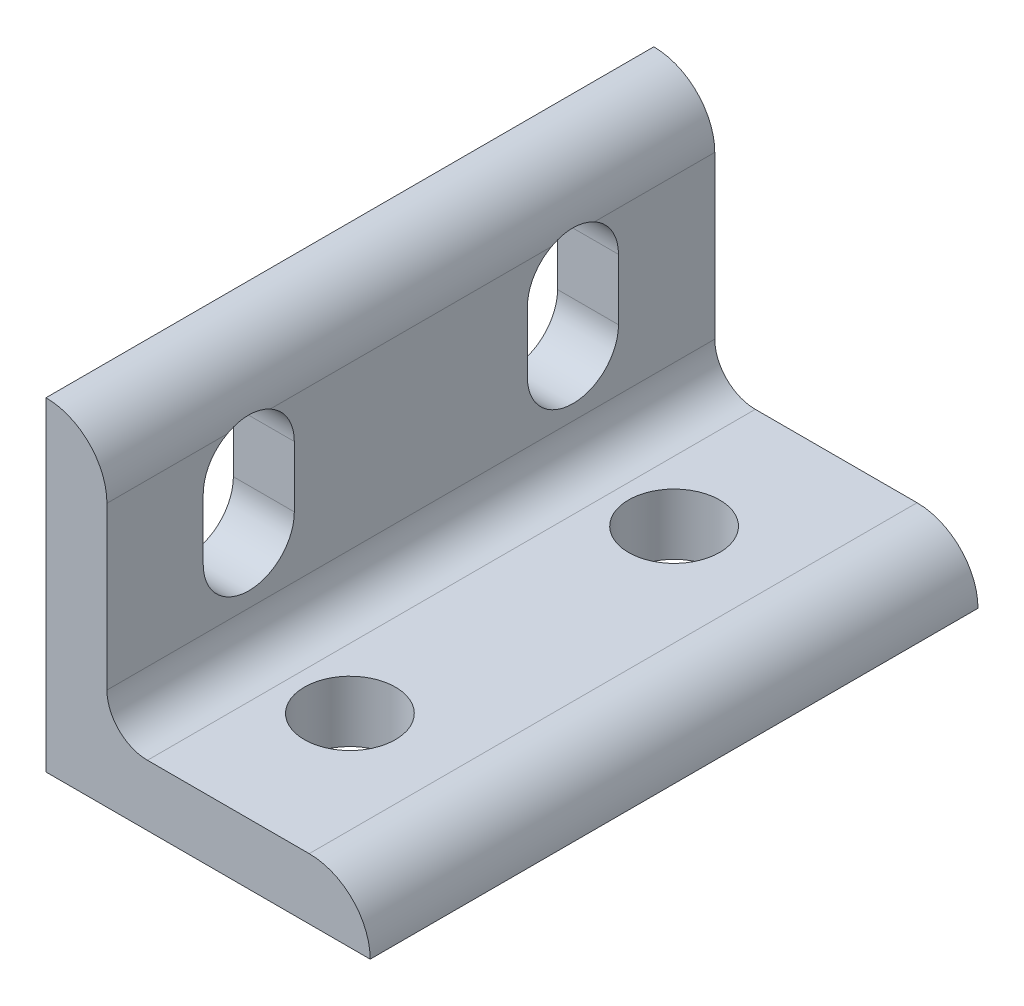
ISO-10303-21;
HEADER;
FILE_DESCRIPTION(('STEP AP214'),'2;1');
FILE_NAME('part.step','',(''),(''),'','','');
FILE_SCHEMA(('AUTOMOTIVE_DESIGN { 1 0 10303 214 1 1 1 1 }'));
ENDSEC;
DATA;
#1=APPLICATION_CONTEXT('core data for automotive mechanical design processes');
#2=APPLICATION_PROTOCOL_DEFINITION('international standard','automotive_design',2000,#1);
#3=PRODUCT_CONTEXT('',#1,'mechanical');
#4=PRODUCT('Part','Part','',(#3));
#5=PRODUCT_RELATED_PRODUCT_CATEGORY('part','',(#4));
#6=PRODUCT_DEFINITION_FORMATION('','',#4);
#7=PRODUCT_DEFINITION_CONTEXT('part definition',#1,'design');
#8=PRODUCT_DEFINITION('design','',#6,#7);
#9=PRODUCT_DEFINITION_SHAPE('','',#8);
#10=(LENGTH_UNIT() NAMED_UNIT(*) SI_UNIT(.MILLI.,.METRE.));
#11=(NAMED_UNIT(*) PLANE_ANGLE_UNIT() SI_UNIT($,.RADIAN.));
#12=(NAMED_UNIT(*) SI_UNIT($,.STERADIAN.) SOLID_ANGLE_UNIT());
#13=UNCERTAINTY_MEASURE_WITH_UNIT(LENGTH_MEASURE(1.E-05),#10,'distance_accuracy_value','');
#14=(GEOMETRIC_REPRESENTATION_CONTEXT(3) GLOBAL_UNCERTAINTY_ASSIGNED_CONTEXT((#13)) GLOBAL_UNIT_ASSIGNED_CONTEXT((#10,
#11,#12)) REPRESENTATION_CONTEXT('',''));
#15=CARTESIAN_POINT('',(0.,0.,0.));
#16=DIRECTION('',(0.,0.,1.));
#17=DIRECTION('',(1.,0.,0.));
#18=AXIS2_PLACEMENT_3D('',#15,#16,#17);
#19=CARTESIAN_POINT('',(-12.7,7.9248,-23.8125));
#20=DIRECTION('',(0.,0.,1.));
#21=DIRECTION('',(1.,0.,0.));
#22=AXIS2_PLACEMENT_3D('',#19,#20,#21);
#23=CYLINDRICAL_SURFACE('',#22,4.7752);
#24=CARTESIAN_POINT('',(-7.9248,7.9248,11.0220132509462));
#25=CARTESIAN_POINT('',(-7.92481560049591,7.97198264026627,11.1105530499581));
#26=CARTESIAN_POINT('',(-7.92550012205361,8.01540977478819,11.2010856695941));
#27=CARTESIAN_POINT('',(-7.92764776843833,8.0944880787926,11.3854704138337));
#28=CARTESIAN_POINT('',(-7.929110840339,8.13013977662214,11.4793223123857));
#29=CARTESIAN_POINT('',(-7.93225439032208,8.19336625267331,11.6695638568773));
#30=CARTESIAN_POINT('',(-7.93393457377952,8.22095181424073,11.7659499252254));
#31=CARTESIAN_POINT('',(-7.93708478391002,8.26791971032118,11.960702632401));
#32=CARTESIAN_POINT('',(-7.93855481380049,8.28730217043143,12.0590692408804));
#33=CARTESIAN_POINT('',(-7.94096961658513,8.31773484760735,12.2571525031942));
#34=CARTESIAN_POINT('',(-7.94191406229188,8.32877987596424,12.3568699584881));
#35=CARTESIAN_POINT('',(-7.94309359017063,8.3424409536407,12.5569310344266));
#36=CARTESIAN_POINT('',(-7.94332834804511,8.34505314954707,12.6572749203435));
#37=CARTESIAN_POINT('',(-7.94304377497829,8.341819075309,12.8578030712449));
#38=CARTESIAN_POINT('',(-7.94252460460012,8.33597460617069,12.9579873656688));
#39=CARTESIAN_POINT('',(-7.94083039182643,8.31587724756712,13.1574567845667));
#40=CARTESIAN_POINT('',(-7.93965566575332,8.30162841323472,13.2567423192529));
#41=CARTESIAN_POINT('',(-7.93701861799582,8.26658902460884,13.4443374260927));
#42=CARTESIAN_POINT('',(-7.93559448865452,8.24655339572945,13.5327894882935));
#43=CARTESIAN_POINT('',(-7.93266836545639,8.19981049650334,13.707906238063));
#44=CARTESIAN_POINT('',(-7.93116637764445,8.17310374348454,13.7945710636631));
#45=CARTESIAN_POINT('',(-7.92842086118506,8.11314773705982,13.9656796838601));
#46=CARTESIAN_POINT('',(-7.92717751363214,8.07989393104252,14.0501218863291));
#47=CARTESIAN_POINT('',(-7.9253721376969,8.00704969992215,14.2162479649546));
#48=CARTESIAN_POINT('',(-7.92481020248326,7.96745840914012,14.2979314624328));
#49=CARTESIAN_POINT('',(-7.9248,7.9248,14.3779867490538));
#50=B_SPLINE_CURVE_WITH_KNOTS('',3,(#24,#25,#26,#27,#28,#29,#30,#31,#32,#33,#34,#35,#36,#37,#38,
#39,#40,#41,#42,#43,#44,#45,#46,#47,#48,#49),.UNSPECIFIED.,.F.,.F.,(4,2,2,2,2,2,2,2,2,2,2,2,4),
(0.,0.300879588223929,0.601738725068878,0.902193795053611,1.20264426462114,1.5032815624204,
1.80405621808537,2.1047668275479,2.40533246174311,2.67718634841712,2.94901916008736,
3.22104166750748,3.49310136403919),.UNSPECIFIED.);
#51=CARTESIAN_POINT('',(-7.9248,7.9248,11.0220132509462));
#52=VERTEX_POINT('',#51);
#53=CARTESIAN_POINT('',(-7.9248,7.9248,14.3779867490538));
#54=VERTEX_POINT('',#53);
#55=EDGE_CURVE('E264',#52,#54,#50,.T.);
#56=ORIENTED_EDGE('',*,*,#55,.F.);
#57=DIRECTION('',(0.,0.,1.));
#58=VECTOR('',#57,1.);
#59=CARTESIAN_POINT('',(-7.9248,7.9248,-23.8125));
#60=LINE('',#59,#58);
#61=CARTESIAN_POINT('',(-7.9248,7.9248,-11.0220132509462));
#62=VERTEX_POINT('',#61);
#63=EDGE_CURVE('E26',#62,#52,#60,.T.);
#64=ORIENTED_EDGE('',*,*,#63,.F.);
#65=CARTESIAN_POINT('',(-7.9248,7.9248,-14.3779867490538));
#66=CARTESIAN_POINT('',(-7.92481560049591,7.97198264026627,-14.2894469500419));
#67=CARTESIAN_POINT('',(-7.92550012205361,8.01540977478819,-14.1989143304059));
#68=CARTESIAN_POINT('',(-7.92764776843833,8.0944880787926,-14.0145295861663));
#69=CARTESIAN_POINT('',(-7.929110840339,8.13013977662214,-13.9206776876143));
#70=CARTESIAN_POINT('',(-7.93225439032208,8.19336625267331,-13.7304361431227));
#71=CARTESIAN_POINT('',(-7.93393457377952,8.22095181424073,-13.6340500747746));
#72=CARTESIAN_POINT('',(-7.93708478391002,8.26791971032118,-13.439297367599));
#73=CARTESIAN_POINT('',(-7.93855481380049,8.28730217043143,-13.3409307591196));
#74=CARTESIAN_POINT('',(-7.94096961658513,8.31773484760735,-13.1428474968058));
#75=CARTESIAN_POINT('',(-7.94191406229188,8.32877987596424,-13.0431300415119));
#76=CARTESIAN_POINT('',(-7.94309359017063,8.3424409536407,-12.8430689655734));
#77=CARTESIAN_POINT('',(-7.94332834804511,8.34505314954707,-12.7427250796565));
#78=CARTESIAN_POINT('',(-7.94304377497829,8.341819075309,-12.5421969287551));
#79=CARTESIAN_POINT('',(-7.94252460460012,8.33597460617069,-12.4420126343312));
#80=CARTESIAN_POINT('',(-7.94083039182643,8.31587724756712,-12.2425432154333));
#81=CARTESIAN_POINT('',(-7.93965566575332,8.30162841323472,-12.1432576807471));
#82=CARTESIAN_POINT('',(-7.93701861799582,8.26658902460884,-11.9556625739073));
#83=CARTESIAN_POINT('',(-7.93559448865452,8.24655339572945,-11.8672105117065));
#84=CARTESIAN_POINT('',(-7.93266836545639,8.19981049650334,-11.692093761937));
#85=CARTESIAN_POINT('',(-7.93116637764445,8.17310374348454,-11.6054289363369));
#86=CARTESIAN_POINT('',(-7.92842086118506,8.11314773705982,-11.4343203161399));
#87=CARTESIAN_POINT('',(-7.92717751363214,8.07989393104252,-11.3498781136709));
#88=CARTESIAN_POINT('',(-7.9253721376969,8.00704969992215,-11.1837520350454));
#89=CARTESIAN_POINT('',(-7.92481020248326,7.96745840914012,-11.1020685375672));
#90=CARTESIAN_POINT('',(-7.9248,7.9248,-11.0220132509462));
#91=B_SPLINE_CURVE_WITH_KNOTS('',3,(#65,#66,#67,#68,#69,#70,#71,#72,#73,#74,#75,#76,#77,#78,#79,
#80,#81,#82,#83,#84,#85,#86,#87,#88,#89,#90),.UNSPECIFIED.,.F.,.F.,(4,2,2,2,2,2,2,2,2,2,2,2,4),
(0.,0.300879588223929,0.601738725068878,0.902193795053611,1.20264426462114,1.50328156242039,
1.80405621808537,2.1047668275479,2.40533246174311,2.67718634841712,2.94901916008735,
3.22104166750748,3.49310136403919),.UNSPECIFIED.);
#92=CARTESIAN_POINT('',(-7.9248,7.9248,-14.3779867490538));
#93=VERTEX_POINT('',#92);
#94=EDGE_CURVE('E205',#93,#62,#91,.T.);
#95=ORIENTED_EDGE('',*,*,#94,.F.);
#96=CARTESIAN_POINT('',(-7.9248,7.9248,-23.8125));
#97=VERTEX_POINT('',#96);
#98=EDGE_CURVE('E11',#97,#93,#60,.T.);
#99=ORIENTED_EDGE('',*,*,#98,.F.);
#100=CARTESIAN_POINT('',(-12.7,7.9248,-23.8125));
#101=DIRECTION('',(0.,0.,1.));
#102=DIRECTION('',(1.,0.,0.));
#103=AXIS2_PLACEMENT_3D('',#100,#101,#102);
#104=CIRCLE('',#103,4.7752);
#105=CARTESIAN_POINT('',(-12.7,12.7,-23.8125));
#106=VERTEX_POINT('',#105);
#107=EDGE_CURVE('E308',#97,#106,#104,.T.);
#108=ORIENTED_EDGE('',*,*,#107,.T.);
#109=DIRECTION('',(0.,0.,1.));
#110=VECTOR('',#109,1.);
#111=CARTESIAN_POINT('',(-12.7,12.7,-23.8125));
#112=LINE('',#111,#110);
#113=CARTESIAN_POINT('',(-12.7,12.7,23.8125));
#114=VERTEX_POINT('',#113);
#115=EDGE_CURVE('E21',#106,#114,#112,.T.);
#116=ORIENTED_EDGE('',*,*,#115,.T.);
#117=CARTESIAN_POINT('',(-12.7,7.9248,23.8125));
#118=DIRECTION('',(0.,0.,1.));
#119=DIRECTION('',(1.,0.,0.));
#120=AXIS2_PLACEMENT_3D('',#117,#118,#119);
#121=CIRCLE('',#120,4.7752);
#122=CARTESIAN_POINT('',(-7.9248,7.9248,23.8125));
#123=VERTEX_POINT('',#122);
#124=EDGE_CURVE('E327',#123,#114,#121,.T.);
#125=ORIENTED_EDGE('',*,*,#124,.F.);
#126=EDGE_CURVE('E28',#54,#123,#60,.T.);
#127=ORIENTED_EDGE('',*,*,#126,.F.);
#128=EDGE_LOOP('',(#56,#64,#95,#99,#108,#116,#125,#127));
#129=FACE_BOUND('',#128,.T.);
#130=ADVANCED_FACE('F17',(#129),#23,.T.);
#131=CARTESIAN_POINT('',(-7.9248,-4.7498,-23.8125));
#132=DIRECTION('',(1.,0.,0.));
#133=DIRECTION('',(0.,0.,-1.));
#134=AXIS2_PLACEMENT_3D('',#131,#132,#133);
#135=PLANE('',#134);
#136=CARTESIAN_POINT('',(-7.9248,4.7752,12.7));
#137=DIRECTION('',(1.,0.,0.));
#138=DIRECTION('',(0.,0.,-1.));
#139=AXIS2_PLACEMENT_3D('',#136,#137,#138);
#140=CIRCLE('',#139,3.5687);
#141=CARTESIAN_POINT('',(-7.9248,4.7752,9.1313));
#142=VERTEX_POINT('',#141);
#143=EDGE_CURVE('E268',#142,#52,#140,.T.);
#144=ORIENTED_EDGE('',*,*,#143,.F.);
#145=DIRECTION('',(0.,1.,0.));
#146=VECTOR('',#145,1.);
#147=CARTESIAN_POINT('',(-7.9248,-4.7498,9.1313));
#148=LINE('',#147,#146);
#149=CARTESIAN_POINT('',(-7.9248,0.,9.1313));
#150=VERTEX_POINT('',#149);
#151=EDGE_CURVE('E357',#150,#142,#148,.T.);
#152=ORIENTED_EDGE('',*,*,#151,.F.);
#153=CARTESIAN_POINT('',(-7.9248,0.,12.7));
#154=DIRECTION('',(1.,0.,0.));
#155=DIRECTION('',(0.,0.,-1.));
#156=AXIS2_PLACEMENT_3D('',#153,#154,#155);
#157=CIRCLE('',#156,3.5687);
#158=CARTESIAN_POINT('',(-7.9248,0.,16.2687));
#159=VERTEX_POINT('',#158);
#160=EDGE_CURVE('E356',#159,#150,#157,.T.);
#161=ORIENTED_EDGE('',*,*,#160,.F.);
#162=DIRECTION('',(0.,-1.,0.));
#163=VECTOR('',#162,1.);
#164=CARTESIAN_POINT('',(-7.9248,-4.7498,16.2687));
#165=LINE('',#164,#163);
#166=CARTESIAN_POINT('',(-7.9248,4.7752,16.2687));
#167=VERTEX_POINT('',#166);
#168=EDGE_CURVE('E213',#167,#159,#165,.T.);
#169=ORIENTED_EDGE('',*,*,#168,.F.);
#170=EDGE_CURVE('E144',#54,#167,#140,.T.);
#171=ORIENTED_EDGE('',*,*,#170,.F.);
#172=ORIENTED_EDGE('',*,*,#126,.T.);
#173=DIRECTION('',(0.,1.,0.));
#174=VECTOR('',#173,1.);
#175=CARTESIAN_POINT('',(-7.9248,-4.7498,23.8125));
#176=LINE('',#175,#174);
#177=CARTESIAN_POINT('',(-7.9248,-4.7498,23.8125));
#178=VERTEX_POINT('',#177);
#179=EDGE_CURVE('E310',#178,#123,#176,.T.);
#180=ORIENTED_EDGE('',*,*,#179,.F.);
#181=DIRECTION('',(0.,0.,1.));
#182=VECTOR('',#181,1.);
#183=CARTESIAN_POINT('',(-7.9248,-4.7498,-23.8125));
#184=LINE('',#183,#182);
#185=CARTESIAN_POINT('',(-7.9248,-4.7498,-23.8125));
#186=VERTEX_POINT('',#185);
#187=EDGE_CURVE('E274',#186,#178,#184,.T.);
#188=ORIENTED_EDGE('',*,*,#187,.F.);
#189=DIRECTION('',(0.,1.,0.));
#190=VECTOR('',#189,1.);
#191=CARTESIAN_POINT('',(-7.9248,-4.7498,-23.8125));
#192=LINE('',#191,#190);
#193=EDGE_CURVE('E277',#186,#97,#192,.T.);
#194=ORIENTED_EDGE('',*,*,#193,.T.);
#195=ORIENTED_EDGE('',*,*,#98,.T.);
#196=CARTESIAN_POINT('',(-7.9248,4.7752,-12.7));
#197=DIRECTION('',(1.,0.,0.));
#198=DIRECTION('',(0.,0.,-1.));
#199=AXIS2_PLACEMENT_3D('',#196,#197,#198);
#200=CIRCLE('',#199,3.5687);
#201=CARTESIAN_POINT('',(-7.9248,4.7752,-16.2687));
#202=VERTEX_POINT('',#201);
#203=EDGE_CURVE('E206',#202,#93,#200,.T.);
#204=ORIENTED_EDGE('',*,*,#203,.F.);
#205=DIRECTION('',(0.,1.,0.));
#206=VECTOR('',#205,1.);
#207=CARTESIAN_POINT('',(-7.9248,-4.7498,-16.2687));
#208=LINE('',#207,#206);
#209=CARTESIAN_POINT('',(-7.9248,0.,-16.2687));
#210=VERTEX_POINT('',#209);
#211=EDGE_CURVE('E201',#210,#202,#208,.T.);
#212=ORIENTED_EDGE('',*,*,#211,.F.);
#213=CARTESIAN_POINT('',(-7.9248,0.,-12.7));
#214=DIRECTION('',(1.,0.,0.));
#215=DIRECTION('',(0.,0.,-1.));
#216=AXIS2_PLACEMENT_3D('',#213,#214,#215);
#217=CIRCLE('',#216,3.5687);
#218=CARTESIAN_POINT('',(-7.9248,0.,-9.1313));
#219=VERTEX_POINT('',#218);
#220=EDGE_CURVE('E199',#219,#210,#217,.T.);
#221=ORIENTED_EDGE('',*,*,#220,.F.);
#222=DIRECTION('',(0.,-1.,0.));
#223=VECTOR('',#222,1.);
#224=CARTESIAN_POINT('',(-7.9248,-4.7498,-9.1313));
#225=LINE('',#224,#223);
#226=CARTESIAN_POINT('',(-7.9248,4.7752,-9.1313));
#227=VERTEX_POINT('',#226);
#228=EDGE_CURVE('E174',#227,#219,#225,.T.);
#229=ORIENTED_EDGE('',*,*,#228,.F.);
#230=EDGE_CURVE('E203',#62,#227,#200,.T.);
#231=ORIENTED_EDGE('',*,*,#230,.F.);
#232=ORIENTED_EDGE('',*,*,#63,.T.);
#233=EDGE_LOOP('',(#144,#152,#161,#169,#171,#172,#180,#188,#194,#195,#204,#212,#221,#229,#231,#232));
#234=FACE_BOUND('',#233,.T.);
#235=ADVANCED_FACE('F232',(#234),#135,.T.);
#236=CARTESIAN_POINT('',(-4.7498,-4.7498,-23.8125));
#237=DIRECTION('',(0.,0.,1.));
#238=DIRECTION('',(1.,0.,0.));
#239=AXIS2_PLACEMENT_3D('',#236,#237,#238);
#240=CYLINDRICAL_SURFACE('',#239,3.175);
#241=ORIENTED_EDGE('',*,*,#187,.T.);
#242=CARTESIAN_POINT('',(-4.7498,-4.7498,23.8125));
#243=DIRECTION('',(0.,0.,-1.));
#244=DIRECTION('',(-1.,0.,0.));
#245=AXIS2_PLACEMENT_3D('',#242,#243,#244);
#246=CIRCLE('',#245,3.175);
#247=CARTESIAN_POINT('',(-4.7498,-7.9248,23.8125));
#248=VERTEX_POINT('',#247);
#249=EDGE_CURVE('E313',#248,#178,#246,.T.);
#250=ORIENTED_EDGE('',*,*,#249,.F.);
#251=DIRECTION('',(0.,0.,1.));
#252=VECTOR('',#251,1.);
#253=CARTESIAN_POINT('',(-4.7498,-7.9248,-23.8125));
#254=LINE('',#253,#252);
#255=CARTESIAN_POINT('',(-4.7498,-7.9248,-23.8125));
#256=VERTEX_POINT('',#255);
#257=EDGE_CURVE('E280',#256,#248,#254,.T.);
#258=ORIENTED_EDGE('',*,*,#257,.F.);
#259=CARTESIAN_POINT('',(-4.7498,-4.7498,-23.8125));
#260=DIRECTION('',(0.,0.,-1.));
#261=DIRECTION('',(-1.,0.,0.));
#262=AXIS2_PLACEMENT_3D('',#259,#260,#261);
#263=CIRCLE('',#262,3.175);
#264=EDGE_CURVE('E292',#256,#186,#263,.T.);
#265=ORIENTED_EDGE('',*,*,#264,.T.);
#266=EDGE_LOOP('',(#241,#250,#258,#265));
#267=FACE_BOUND('',#266,.T.);
#268=ADVANCED_FACE('F235',(#267),#240,.F.);
#269=CARTESIAN_POINT('',(7.9248,-7.9248,-23.8125));
#270=DIRECTION('',(0.,1.,0.));
#271=DIRECTION('',(-1.,0.,0.));
#272=AXIS2_PLACEMENT_3D('',#269,#270,#271);
#273=PLANE('',#272);
#274=CARTESIAN_POINT('',(0.,-7.9248,12.7));
#275=DIRECTION('',(0.,1.,0.));
#276=DIRECTION('',(-1.,0.,0.));
#277=AXIS2_PLACEMENT_3D('',#274,#275,#276);
#278=CIRCLE('',#277,3.5687);
#279=CARTESIAN_POINT('',(-3.5687,-7.9248,12.7));
#280=VERTEX_POINT('',#279);
#281=EDGE_CURVE('E398',#280,#280,#278,.T.);
#282=ORIENTED_EDGE('',*,*,#281,.F.);
#283=EDGE_LOOP('',(#282));
#284=FACE_BOUND('',#283,.T.);
#285=CARTESIAN_POINT('',(0.,-7.9248,-12.7));
#286=DIRECTION('',(0.,1.,0.));
#287=DIRECTION('',(1.,0.,0.));
#288=AXIS2_PLACEMENT_3D('',#285,#286,#287);
#289=CIRCLE('',#288,3.5687);
#290=CARTESIAN_POINT('',(3.5687,-7.9248,-12.7));
#291=VERTEX_POINT('',#290);
#292=EDGE_CURVE('E167',#291,#291,#289,.T.);
#293=ORIENTED_EDGE('',*,*,#292,.F.);
#294=EDGE_LOOP('',(#293));
#295=FACE_BOUND('',#294,.T.);
#296=ORIENTED_EDGE('',*,*,#257,.T.);
#297=DIRECTION('',(-1.,0.,0.));
#298=VECTOR('',#297,1.);
#299=CARTESIAN_POINT('',(7.9248,-7.9248,23.8125));
#300=LINE('',#299,#298);
#301=CARTESIAN_POINT('',(7.9248,-7.9248,23.8125));
#302=VERTEX_POINT('',#301);
#303=EDGE_CURVE('E316',#302,#248,#300,.T.);
#304=ORIENTED_EDGE('',*,*,#303,.F.);
#305=DIRECTION('',(0.,0.,1.));
#306=VECTOR('',#305,1.);
#307=CARTESIAN_POINT('',(7.9248,-7.9248,-23.8125));
#308=LINE('',#307,#306);
#309=CARTESIAN_POINT('',(7.9248,-7.9248,-23.8125));
#310=VERTEX_POINT('',#309);
#311=EDGE_CURVE('E282',#310,#302,#308,.T.);
#312=ORIENTED_EDGE('',*,*,#311,.F.);
#313=DIRECTION('',(-1.,0.,0.));
#314=VECTOR('',#313,1.);
#315=CARTESIAN_POINT('',(7.9248,-7.9248,-23.8125));
#316=LINE('',#315,#314);
#317=EDGE_CURVE('E295',#310,#256,#316,.T.);
#318=ORIENTED_EDGE('',*,*,#317,.T.);
#319=EDGE_LOOP('',(#296,#304,#312,#318));
#320=FACE_BOUND('',#319,.T.);
#321=ADVANCED_FACE('F239',(#284,#295,#320),#273,.T.);
#322=CARTESIAN_POINT('',(7.9248,-12.7,-23.8125));
#323=DIRECTION('',(0.,0.,1.));
#324=DIRECTION('',(1.,0.,0.));
#325=AXIS2_PLACEMENT_3D('',#322,#323,#324);
#326=CYLINDRICAL_SURFACE('',#325,4.7752);
#327=ORIENTED_EDGE('',*,*,#311,.T.);
#328=CARTESIAN_POINT('',(7.9248,-12.7,23.8125));
#329=DIRECTION('',(0.,0.,1.));
#330=DIRECTION('',(-1.,0.,0.));
#331=AXIS2_PLACEMENT_3D('',#328,#329,#330);
#332=CIRCLE('',#331,4.7752);
#333=CARTESIAN_POINT('',(12.7,-12.7,23.8125));
#334=VERTEX_POINT('',#333);
#335=EDGE_CURVE('E319',#334,#302,#332,.T.);
#336=ORIENTED_EDGE('',*,*,#335,.F.);
#337=DIRECTION('',(0.,0.,1.));
#338=VECTOR('',#337,1.);
#339=CARTESIAN_POINT('',(12.7,-12.7,-23.8125));
#340=LINE('',#339,#338);
#341=CARTESIAN_POINT('',(12.7,-12.7,-23.8125));
#342=VERTEX_POINT('',#341);
#343=EDGE_CURVE('E284',#342,#334,#340,.T.);
#344=ORIENTED_EDGE('',*,*,#343,.F.);
#345=CARTESIAN_POINT('',(7.9248,-12.7,-23.8125));
#346=DIRECTION('',(0.,0.,1.));
#347=DIRECTION('',(-1.,0.,0.));
#348=AXIS2_PLACEMENT_3D('',#345,#346,#347);
#349=CIRCLE('',#348,4.7752);
#350=EDGE_CURVE('E298',#342,#310,#349,.T.);
#351=ORIENTED_EDGE('',*,*,#350,.T.);
#352=EDGE_LOOP('',(#327,#336,#344,#351));
#353=FACE_BOUND('',#352,.T.);
#354=ADVANCED_FACE('F243',(#353),#326,.T.);
#355=CARTESIAN_POINT('',(-12.7,-12.7,-23.8125));
#356=DIRECTION('',(0.,-1.,0.));
#357=DIRECTION('',(0.,0.,-1.));
#358=AXIS2_PLACEMENT_3D('',#355,#356,#357);
#359=PLANE('',#358);
#360=CARTESIAN_POINT('',(0.,-12.7,12.7));
#361=DIRECTION('',(0.,1.,0.));
#362=DIRECTION('',(-1.,0.,0.));
#363=AXIS2_PLACEMENT_3D('',#360,#361,#362);
#364=CIRCLE('',#363,3.5687);
#365=CARTESIAN_POINT('',(-3.5687,-12.7,12.7));
#366=VERTEX_POINT('',#365);
#367=EDGE_CURVE('E183',#366,#366,#364,.T.);
#368=ORIENTED_EDGE('',*,*,#367,.T.);
#369=EDGE_LOOP('',(#368));
#370=FACE_BOUND('',#369,.T.);
#371=CARTESIAN_POINT('',(0.,-12.7,-12.7));
#372=DIRECTION('',(0.,1.,0.));
#373=DIRECTION('',(1.,0.,0.));
#374=AXIS2_PLACEMENT_3D('',#371,#372,#373);
#375=CIRCLE('',#374,3.5687);
#376=CARTESIAN_POINT('',(3.56870000000001,-12.7,-12.7));
#377=VERTEX_POINT('',#376);
#378=EDGE_CURVE('E399',#377,#377,#375,.T.);
#379=ORIENTED_EDGE('',*,*,#378,.T.);
#380=EDGE_LOOP('',(#379));
#381=FACE_BOUND('',#380,.T.);
#382=ORIENTED_EDGE('',*,*,#343,.T.);
#383=DIRECTION('',(1.,0.,0.));
#384=VECTOR('',#383,1.);
#385=CARTESIAN_POINT('',(-12.7,-12.7,23.8125));
#386=LINE('',#385,#384);
#387=CARTESIAN_POINT('',(-12.7,-12.7,23.8125));
#388=VERTEX_POINT('',#387);
#389=EDGE_CURVE('E322',#388,#334,#386,.T.);
#390=ORIENTED_EDGE('',*,*,#389,.F.);
#391=DIRECTION('',(0.,0.,1.));
#392=VECTOR('',#391,1.);
#393=CARTESIAN_POINT('',(-12.7,-12.7,-23.8125));
#394=LINE('',#393,#392);
#395=CARTESIAN_POINT('',(-12.7,-12.7,-23.8125));
#396=VERTEX_POINT('',#395);
#397=EDGE_CURVE('E285',#396,#388,#394,.T.);
#398=ORIENTED_EDGE('',*,*,#397,.F.);
#399=DIRECTION('',(1.,0.,0.));
#400=VECTOR('',#399,1.);
#401=CARTESIAN_POINT('',(-12.7,-12.7,-23.8125));
#402=LINE('',#401,#400);
#403=EDGE_CURVE('E303',#396,#342,#402,.T.);
#404=ORIENTED_EDGE('',*,*,#403,.T.);
#405=EDGE_LOOP('',(#382,#390,#398,#404));
#406=FACE_BOUND('',#405,.T.);
#407=ADVANCED_FACE('F247',(#370,#381,#406),#359,.T.);
#408=CARTESIAN_POINT('',(-12.7,12.7,-23.8125));
#409=DIRECTION('',(-1.,0.,0.));
#410=DIRECTION('',(0.,0.,1.));
#411=AXIS2_PLACEMENT_3D('',#408,#409,#410);
#412=PLANE('',#411);
#413=CARTESIAN_POINT('',(-12.7,4.7752,12.7));
#414=DIRECTION('',(1.,0.,0.));
#415=DIRECTION('',(0.,0.,-1.));
#416=AXIS2_PLACEMENT_3D('',#413,#414,#415);
#417=CIRCLE('',#416,3.5687);
#418=CARTESIAN_POINT('',(-12.7,4.7752,9.1313));
#419=VERTEX_POINT('',#418);
#420=CARTESIAN_POINT('',(-12.7,4.7752,16.2687));
#421=VERTEX_POINT('',#420);
#422=EDGE_CURVE('E141',#419,#421,#417,.T.);
#423=ORIENTED_EDGE('',*,*,#422,.T.);
#424=DIRECTION('',(0.,-1.,0.));
#425=VECTOR('',#424,1.);
#426=CARTESIAN_POINT('',(-12.7,4.7752,16.2687));
#427=LINE('',#426,#425);
#428=CARTESIAN_POINT('',(-12.7,0.,16.2687));
#429=VERTEX_POINT('',#428);
#430=EDGE_CURVE('E151',#421,#429,#427,.T.);
#431=ORIENTED_EDGE('',*,*,#430,.T.);
#432=CARTESIAN_POINT('',(-12.7,0.,12.7));
#433=DIRECTION('',(1.,0.,0.));
#434=DIRECTION('',(0.,0.,-1.));
#435=AXIS2_PLACEMENT_3D('',#432,#433,#434);
#436=CIRCLE('',#435,3.5687);
#437=CARTESIAN_POINT('',(-12.7,0.,9.1313));
#438=VERTEX_POINT('',#437);
#439=EDGE_CURVE('E156',#429,#438,#436,.T.);
#440=ORIENTED_EDGE('',*,*,#439,.T.);
#441=DIRECTION('',(0.,1.,0.));
#442=VECTOR('',#441,1.);
#443=CARTESIAN_POINT('',(-12.7,4.7752,9.1313));
#444=LINE('',#443,#442);
#445=EDGE_CURVE('E147',#438,#419,#444,.T.);
#446=ORIENTED_EDGE('',*,*,#445,.T.);
#447=EDGE_LOOP('',(#423,#431,#440,#446));
#448=FACE_BOUND('',#447,.T.);
#449=CARTESIAN_POINT('',(-12.7,4.7752,-12.7));
#450=DIRECTION('',(1.,0.,0.));
#451=DIRECTION('',(0.,0.,1.));
#452=AXIS2_PLACEMENT_3D('',#449,#450,#451);
#453=CIRCLE('',#452,3.5687);
#454=CARTESIAN_POINT('',(-12.7,4.7752,-16.2687));
#455=VERTEX_POINT('',#454);
#456=CARTESIAN_POINT('',(-12.7,4.7752,-9.1313));
#457=VERTEX_POINT('',#456);
#458=EDGE_CURVE('E179',#455,#457,#453,.T.);
#459=ORIENTED_EDGE('',*,*,#458,.T.);
#460=DIRECTION('',(0.,-1.,0.));
#461=VECTOR('',#460,1.);
#462=CARTESIAN_POINT('',(-12.7,4.7752,-9.1313));
#463=LINE('',#462,#461);
#464=CARTESIAN_POINT('',(-12.7,0.,-9.1313));
#465=VERTEX_POINT('',#464);
#466=EDGE_CURVE('E182',#457,#465,#463,.T.);
#467=ORIENTED_EDGE('',*,*,#466,.T.);
#468=CARTESIAN_POINT('',(-12.7,0.,-12.7));
#469=DIRECTION('',(1.,0.,0.));
#470=DIRECTION('',(0.,0.,1.));
#471=AXIS2_PLACEMENT_3D('',#468,#469,#470);
#472=CIRCLE('',#471,3.5687);
#473=CARTESIAN_POINT('',(-12.7,0.,-16.2687));
#474=VERTEX_POINT('',#473);
#475=EDGE_CURVE('E186',#465,#474,#472,.T.);
#476=ORIENTED_EDGE('',*,*,#475,.T.);
#477=DIRECTION('',(0.,1.,0.));
#478=VECTOR('',#477,1.);
#479=CARTESIAN_POINT('',(-12.7,4.7752,-16.2687));
#480=LINE('',#479,#478);
#481=EDGE_CURVE('E189',#474,#455,#480,.T.);
#482=ORIENTED_EDGE('',*,*,#481,.T.);
#483=EDGE_LOOP('',(#459,#467,#476,#482));
#484=FACE_BOUND('',#483,.T.);
#485=ORIENTED_EDGE('',*,*,#397,.T.);
#486=DIRECTION('',(0.,-1.,0.));
#487=VECTOR('',#486,1.);
#488=CARTESIAN_POINT('',(-12.7,12.7,23.8125));
#489=LINE('',#488,#487);
#490=EDGE_CURVE('E325',#114,#388,#489,.T.);
#491=ORIENTED_EDGE('',*,*,#490,.F.);
#492=ORIENTED_EDGE('',*,*,#115,.F.);
#493=DIRECTION('',(0.,-1.,0.));
#494=VECTOR('',#493,1.);
#495=CARTESIAN_POINT('',(-12.7,12.7,-23.8125));
#496=LINE('',#495,#494);
#497=EDGE_CURVE('E306',#106,#396,#496,.T.);
#498=ORIENTED_EDGE('',*,*,#497,.T.);
#499=EDGE_LOOP('',(#485,#491,#492,#498));
#500=FACE_BOUND('',#499,.T.);
#501=ADVANCED_FACE('F158',(#448,#484,#500),#412,.T.);
#502=CARTESIAN_POINT('',(-12.7,7.9248,-23.8125));
#503=DIRECTION('',(0.,0.,1.));
#504=DIRECTION('',(1.,0.,0.));
#505=AXIS2_PLACEMENT_3D('',#502,#503,#504);
#506=PLANE('',#505);
#507=ORIENTED_EDGE('',*,*,#107,.F.);
#508=ORIENTED_EDGE('',*,*,#193,.F.);
#509=ORIENTED_EDGE('',*,*,#264,.F.);
#510=ORIENTED_EDGE('',*,*,#317,.F.);
#511=ORIENTED_EDGE('',*,*,#350,.F.);
#512=ORIENTED_EDGE('',*,*,#403,.F.);
#513=ORIENTED_EDGE('',*,*,#497,.F.);
#514=EDGE_LOOP('',(#507,#508,#509,#510,#511,#512,#513));
#515=FACE_BOUND('',#514,.T.);
#516=ADVANCED_FACE('F227',(#515),#506,.F.);
#517=CARTESIAN_POINT('',(-12.7,7.9248,23.8125));
#518=DIRECTION('',(0.,0.,1.));
#519=DIRECTION('',(1.,0.,0.));
#520=AXIS2_PLACEMENT_3D('',#517,#518,#519);
#521=PLANE('',#520);
#522=ORIENTED_EDGE('',*,*,#124,.T.);
#523=ORIENTED_EDGE('',*,*,#490,.T.);
#524=ORIENTED_EDGE('',*,*,#389,.T.);
#525=ORIENTED_EDGE('',*,*,#335,.T.);
#526=ORIENTED_EDGE('',*,*,#303,.T.);
#527=ORIENTED_EDGE('',*,*,#249,.T.);
#528=ORIENTED_EDGE('',*,*,#179,.T.);
#529=EDGE_LOOP('',(#522,#523,#524,#525,#526,#527,#528));
#530=FACE_BOUND('',#529,.T.);
#531=ADVANCED_FACE('F221',(#530),#521,.T.);
#532=CARTESIAN_POINT('',(-12.7,4.7752,-12.7));
#533=DIRECTION('',(1.,0.,0.));
#534=DIRECTION('',(0.,0.,-1.));
#535=AXIS2_PLACEMENT_3D('',#532,#533,#534);
#536=CYLINDRICAL_SURFACE('',#535,3.5687);
#537=ORIENTED_EDGE('',*,*,#203,.T.);
#538=ORIENTED_EDGE('',*,*,#94,.T.);
#539=ORIENTED_EDGE('',*,*,#230,.T.);
#540=DIRECTION('',(1.,0.,0.));
#541=VECTOR('',#540,1.);
#542=CARTESIAN_POINT('',(-12.7,4.7752,-9.1313));
#543=LINE('',#542,#541);
#544=EDGE_CURVE('E43',#457,#227,#543,.T.);
#545=ORIENTED_EDGE('',*,*,#544,.F.);
#546=ORIENTED_EDGE('',*,*,#458,.F.);
#547=DIRECTION('',(1.,0.,0.));
#548=VECTOR('',#547,1.);
#549=CARTESIAN_POINT('',(-12.7,4.7752,-16.2687));
#550=LINE('',#549,#548);
#551=EDGE_CURVE('E161',#455,#202,#550,.T.);
#552=ORIENTED_EDGE('',*,*,#551,.T.);
#553=EDGE_LOOP('',(#537,#538,#539,#545,#546,#552));
#554=FACE_BOUND('',#553,.T.);
#555=ADVANCED_FACE('F215',(#554),#536,.F.);
#556=CARTESIAN_POINT('',(-12.7,4.7752,-16.2687));
#557=DIRECTION('',(0.,0.,-1.));
#558=DIRECTION('',(-1.,0.,0.));
#559=AXIS2_PLACEMENT_3D('',#556,#557,#558);
#560=PLANE('',#559);
#561=ORIENTED_EDGE('',*,*,#211,.T.);
#562=ORIENTED_EDGE('',*,*,#551,.F.);
#563=ORIENTED_EDGE('',*,*,#481,.F.);
#564=DIRECTION('',(1.,0.,0.));
#565=VECTOR('',#564,1.);
#566=CARTESIAN_POINT('',(-12.7,0.,-16.2687));
#567=LINE('',#566,#565);
#568=EDGE_CURVE('E164',#474,#210,#567,.T.);
#569=ORIENTED_EDGE('',*,*,#568,.T.);
#570=EDGE_LOOP('',(#561,#562,#563,#569));
#571=FACE_BOUND('',#570,.T.);
#572=ADVANCED_FACE('F220',(#571),#560,.F.);
#573=CARTESIAN_POINT('',(-12.7,0.,-12.7));
#574=DIRECTION('',(1.,0.,0.));
#575=DIRECTION('',(0.,0.,-1.));
#576=AXIS2_PLACEMENT_3D('',#573,#574,#575);
#577=CYLINDRICAL_SURFACE('',#576,3.5687);
#578=ORIENTED_EDGE('',*,*,#220,.T.);
#579=ORIENTED_EDGE('',*,*,#568,.F.);
#580=ORIENTED_EDGE('',*,*,#475,.F.);
#581=DIRECTION('',(1.,0.,0.));
#582=VECTOR('',#581,1.);
#583=CARTESIAN_POINT('',(-12.7,0.,-9.1313));
#584=LINE('',#583,#582);
#585=EDGE_CURVE('E194',#465,#219,#584,.T.);
#586=ORIENTED_EDGE('',*,*,#585,.T.);
#587=EDGE_LOOP('',(#578,#579,#580,#586));
#588=FACE_BOUND('',#587,.T.);
#589=ADVANCED_FACE('F343',(#588),#577,.F.);
#590=CARTESIAN_POINT('',(-12.7,4.7752,-9.1313));
#591=DIRECTION('',(0.,0.,1.));
#592=DIRECTION('',(0.,-1.,0.));
#593=AXIS2_PLACEMENT_3D('',#590,#591,#592);
#594=PLANE('',#593);
#595=ORIENTED_EDGE('',*,*,#228,.T.);
#596=ORIENTED_EDGE('',*,*,#585,.F.);
#597=ORIENTED_EDGE('',*,*,#466,.F.);
#598=ORIENTED_EDGE('',*,*,#544,.T.);
#599=EDGE_LOOP('',(#595,#596,#597,#598));
#600=FACE_BOUND('',#599,.T.);
#601=ADVANCED_FACE('F223',(#600),#594,.F.);
#602=CARTESIAN_POINT('',(-12.7,4.7752,12.7));
#603=DIRECTION('',(1.,0.,0.));
#604=DIRECTION('',(0.,0.,-1.));
#605=AXIS2_PLACEMENT_3D('',#602,#603,#604);
#606=CYLINDRICAL_SURFACE('',#605,3.5687);
#607=ORIENTED_EDGE('',*,*,#143,.T.);
#608=ORIENTED_EDGE('',*,*,#55,.T.);
#609=ORIENTED_EDGE('',*,*,#170,.T.);
#610=DIRECTION('',(1.,0.,0.));
#611=VECTOR('',#610,1.);
#612=CARTESIAN_POINT('',(-12.7,4.7752,16.2687));
#613=LINE('',#612,#611);
#614=EDGE_CURVE('E35',#421,#167,#613,.T.);
#615=ORIENTED_EDGE('',*,*,#614,.F.);
#616=ORIENTED_EDGE('',*,*,#422,.F.);
#617=DIRECTION('',(1.,0.,0.));
#618=VECTOR('',#617,1.);
#619=CARTESIAN_POINT('',(-12.7,4.7752,9.1313));
#620=LINE('',#619,#618);
#621=EDGE_CURVE('E172',#419,#142,#620,.T.);
#622=ORIENTED_EDGE('',*,*,#621,.T.);
#623=EDGE_LOOP('',(#607,#608,#609,#615,#616,#622));
#624=FACE_BOUND('',#623,.T.);
#625=ADVANCED_FACE('F138',(#624),#606,.F.);
#626=CARTESIAN_POINT('',(-12.7,4.7752,9.1313));
#627=DIRECTION('',(0.,0.,-1.));
#628=DIRECTION('',(0.,1.,0.));
#629=AXIS2_PLACEMENT_3D('',#626,#627,#628);
#630=PLANE('',#629);
#631=ORIENTED_EDGE('',*,*,#151,.T.);
#632=ORIENTED_EDGE('',*,*,#621,.F.);
#633=ORIENTED_EDGE('',*,*,#445,.F.);
#634=DIRECTION('',(1.,0.,0.));
#635=VECTOR('',#634,1.);
#636=CARTESIAN_POINT('',(-12.7,0.,9.1313));
#637=LINE('',#636,#635);
#638=EDGE_CURVE('E175',#438,#150,#637,.T.);
#639=ORIENTED_EDGE('',*,*,#638,.T.);
#640=EDGE_LOOP('',(#631,#632,#633,#639));
#641=FACE_BOUND('',#640,.T.);
#642=ADVANCED_FACE('F340',(#641),#630,.F.);
#643=CARTESIAN_POINT('',(-12.7,0.,12.7));
#644=DIRECTION('',(1.,0.,0.));
#645=DIRECTION('',(0.,0.,-1.));
#646=AXIS2_PLACEMENT_3D('',#643,#644,#645);
#647=CYLINDRICAL_SURFACE('',#646,3.5687);
#648=ORIENTED_EDGE('',*,*,#160,.T.);
#649=ORIENTED_EDGE('',*,*,#638,.F.);
#650=ORIENTED_EDGE('',*,*,#439,.F.);
#651=DIRECTION('',(1.,0.,0.));
#652=VECTOR('',#651,1.);
#653=CARTESIAN_POINT('',(-12.7,0.,16.2687));
#654=LINE('',#653,#652);
#655=EDGE_CURVE('E146',#429,#159,#654,.T.);
#656=ORIENTED_EDGE('',*,*,#655,.T.);
#657=EDGE_LOOP('',(#648,#649,#650,#656));
#658=FACE_BOUND('',#657,.T.);
#659=ADVANCED_FACE('F361',(#658),#647,.F.);
#660=CARTESIAN_POINT('',(-12.7,4.7752,16.2687));
#661=DIRECTION('',(0.,0.,1.));
#662=DIRECTION('',(1.,0.,0.));
#663=AXIS2_PLACEMENT_3D('',#660,#661,#662);
#664=PLANE('',#663);
#665=ORIENTED_EDGE('',*,*,#168,.T.);
#666=ORIENTED_EDGE('',*,*,#655,.F.);
#667=ORIENTED_EDGE('',*,*,#430,.F.);
#668=ORIENTED_EDGE('',*,*,#614,.T.);
#669=EDGE_LOOP('',(#665,#666,#667,#668));
#670=FACE_BOUND('',#669,.T.);
#671=ADVANCED_FACE('F152',(#670),#664,.F.);
#672=CARTESIAN_POINT('',(0.,-12.7,-12.7));
#673=DIRECTION('',(0.,1.,0.));
#674=DIRECTION('',(-1.,0.,0.));
#675=AXIS2_PLACEMENT_3D('',#672,#673,#674);
#676=CYLINDRICAL_SURFACE('',#675,3.5687);
#677=ORIENTED_EDGE('',*,*,#378,.F.);
#678=EDGE_LOOP('',(#677));
#679=FACE_BOUND('',#678,.T.);
#680=ORIENTED_EDGE('',*,*,#292,.T.);
#681=EDGE_LOOP('',(#680));
#682=FACE_BOUND('',#681,.T.);
#683=ADVANCED_FACE('F381',(#679,#682),#676,.F.);
#684=CARTESIAN_POINT('',(0.,-12.7,12.7));
#685=DIRECTION('',(0.,1.,0.));
#686=DIRECTION('',(-1.,0.,0.));
#687=AXIS2_PLACEMENT_3D('',#684,#685,#686);
#688=CYLINDRICAL_SURFACE('',#687,3.5687);
#689=ORIENTED_EDGE('',*,*,#367,.F.);
#690=EDGE_LOOP('',(#689));
#691=FACE_BOUND('',#690,.T.);
#692=ORIENTED_EDGE('',*,*,#281,.T.);
#693=EDGE_LOOP('',(#692));
#694=FACE_BOUND('',#693,.T.);
#695=ADVANCED_FACE('F386',(#691,#694),#688,.F.);
#696=CLOSED_SHELL('',(#130,#235,#268,#321,#354,#407,#501,#516,#531,#555,#572,#589,#601,#625,
#642,#659,#671,#683,#695));
#697=MANIFOLD_SOLID_BREP('B1',#696);
#698=ADVANCED_BREP_SHAPE_REPRESENTATION('',(#18,#697),#14);
#699=SHAPE_DEFINITION_REPRESENTATION(#9,#698);
ENDSEC;
END-ISO-10303-21;
